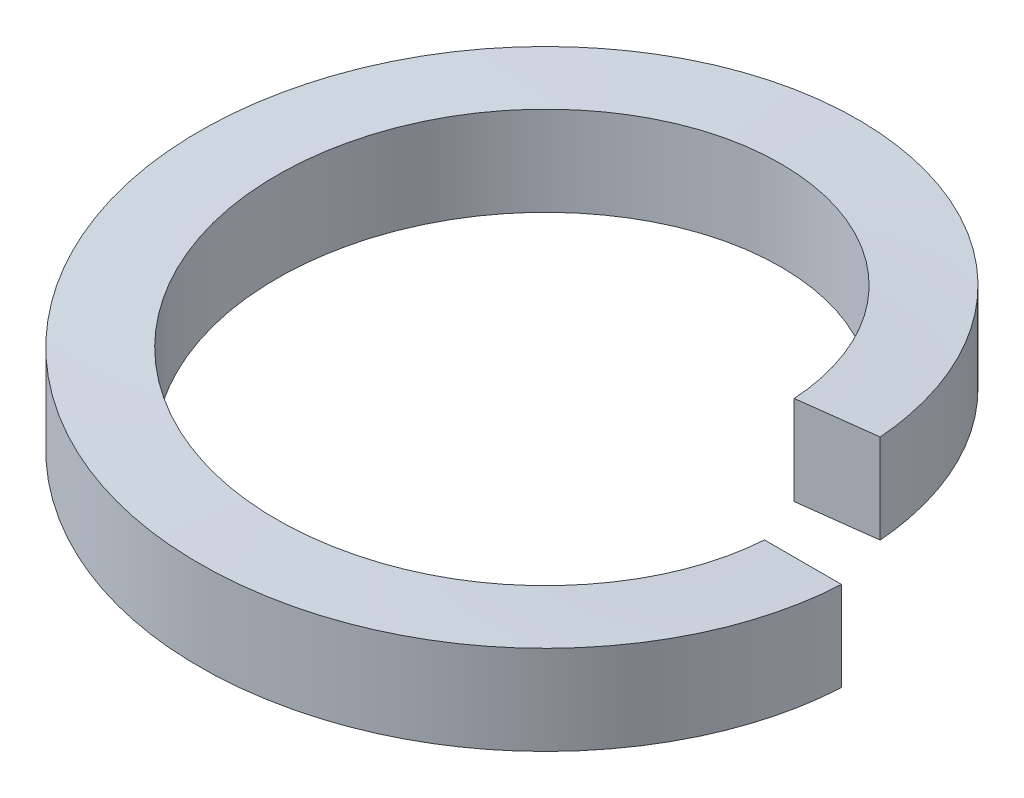
ISO-10303-21;
HEADER;
FILE_DESCRIPTION(('STEP AP214'),'2;1');
FILE_NAME('part.step','',(''),(''),'','','');
FILE_SCHEMA(('AUTOMOTIVE_DESIGN { 1 0 10303 214 1 1 1 1 }'));
ENDSEC;
DATA;
#1=APPLICATION_CONTEXT('core data for automotive mechanical design processes');
#2=APPLICATION_PROTOCOL_DEFINITION('international standard','automotive_design',2000,#1);
#3=PRODUCT_CONTEXT('',#1,'mechanical');
#4=PRODUCT('Part','Part','',(#3));
#5=PRODUCT_RELATED_PRODUCT_CATEGORY('part','',(#4));
#6=PRODUCT_DEFINITION_FORMATION('','',#4);
#7=PRODUCT_DEFINITION_CONTEXT('part definition',#1,'design');
#8=PRODUCT_DEFINITION('design','',#6,#7);
#9=PRODUCT_DEFINITION_SHAPE('','',#8);
#10=(LENGTH_UNIT() NAMED_UNIT(*) SI_UNIT(.MILLI.,.METRE.));
#11=(NAMED_UNIT(*) PLANE_ANGLE_UNIT() SI_UNIT($,.RADIAN.));
#12=(NAMED_UNIT(*) SI_UNIT($,.STERADIAN.) SOLID_ANGLE_UNIT());
#13=UNCERTAINTY_MEASURE_WITH_UNIT(LENGTH_MEASURE(1.E-05),#10,'distance_accuracy_value','');
#14=(GEOMETRIC_REPRESENTATION_CONTEXT(3) GLOBAL_UNCERTAINTY_ASSIGNED_CONTEXT((#13)) GLOBAL_UNIT_ASSIGNED_CONTEXT((#10,
#11,#12)) REPRESENTATION_CONTEXT('',''));
#15=CARTESIAN_POINT('',(0.,0.,0.));
#16=DIRECTION('',(0.,0.,1.));
#17=DIRECTION('',(1.,0.,0.));
#18=AXIS2_PLACEMENT_3D('',#15,#16,#17);
#19=CARTESIAN_POINT('',(3.28,0.58,0.));
#20=DIRECTION('',(0.,0.,1.));
#21=DIRECTION('',(1.,0.,0.));
#22=AXIS2_PLACEMENT_3D('',#19,#20,#21);
#23=PLANE('',#22);
#24=CARTESIAN_POINT('',(3.28,1.16,0.));
#25=CARTESIAN_POINT('',(3.28,0.,0.));
#26=(BOUNDED_CURVE() B_SPLINE_CURVE(1,(#24,#25),.UNSPECIFIED.,.F.,
.F.) B_SPLINE_CURVE_WITH_KNOTS((2,2),(0.,1.),
.UNSPECIFIED.) CURVE() GEOMETRIC_REPRESENTATION_ITEM() RATIONAL_B_SPLINE_CURVE((1.,1.)) REPRESENTATION_ITEM(''));
#27=CARTESIAN_POINT('',(3.28,1.16,0.));
#28=VERTEX_POINT('',#27);
#29=CARTESIAN_POINT('',(3.28,0.,0.));
#30=VERTEX_POINT('',#29);
#31=EDGE_CURVE('E53',#28,#30,#26,.T.);
#32=ORIENTED_EDGE('',*,*,#31,.F.);
#33=CARTESIAN_POINT('',(4.28,1.16,0.));
#34=CARTESIAN_POINT('',(3.28,1.16,0.));
#35=(BOUNDED_CURVE() B_SPLINE_CURVE(1,(#33,#34),.UNSPECIFIED.,.F.,
.F.) B_SPLINE_CURVE_WITH_KNOTS((2,2),(0.,1.),
.UNSPECIFIED.) CURVE() GEOMETRIC_REPRESENTATION_ITEM() RATIONAL_B_SPLINE_CURVE((1.,1.)) REPRESENTATION_ITEM(''));
#36=CARTESIAN_POINT('',(4.28,1.16,0.));
#37=VERTEX_POINT('',#36);
#38=EDGE_CURVE('E66',#37,#28,#35,.T.);
#39=ORIENTED_EDGE('',*,*,#38,.F.);
#40=CARTESIAN_POINT('',(4.28,0.,0.));
#41=CARTESIAN_POINT('',(4.28,1.16,0.));
#42=(BOUNDED_CURVE() B_SPLINE_CURVE(1,(#40,#41),.UNSPECIFIED.,.F.,
.F.) B_SPLINE_CURVE_WITH_KNOTS((2,2),(0.,1.),
.UNSPECIFIED.) CURVE() GEOMETRIC_REPRESENTATION_ITEM() RATIONAL_B_SPLINE_CURVE((1.,1.)) REPRESENTATION_ITEM(''));
#43=CARTESIAN_POINT('',(4.28,0.,0.));
#44=VERTEX_POINT('',#43);
#45=EDGE_CURVE('E104',#44,#37,#42,.T.);
#46=ORIENTED_EDGE('',*,*,#45,.F.);
#47=CARTESIAN_POINT('',(3.28,0.,0.));
#48=CARTESIAN_POINT('',(4.28,0.,0.));
#49=(BOUNDED_CURVE() B_SPLINE_CURVE(1,(#47,#48),.UNSPECIFIED.,.F.,
.F.) B_SPLINE_CURVE_WITH_KNOTS((2,2),(0.,1.),
.UNSPECIFIED.) CURVE() GEOMETRIC_REPRESENTATION_ITEM() RATIONAL_B_SPLINE_CURVE((1.,1.)) REPRESENTATION_ITEM(''));
#50=EDGE_CURVE('E87',#30,#44,#49,.T.);
#51=ORIENTED_EDGE('',*,*,#50,.F.);
#52=EDGE_LOOP('',(#32,#39,#46,#51));
#53=FACE_BOUND('',#52,.T.);
#54=ADVANCED_FACE('F42',(#53),#23,.F.);
#55=CARTESIAN_POINT('',(3.25412922151744,1.66283042754643,-0.411148403458249));
#56=DIRECTION('',(0.125350122672277,0.,0.992112567577916));
#57=DIRECTION('',(0.992112567577916,0.,-0.125350122672277));
#58=AXIS2_PLACEMENT_3D('',#55,#56,#57);
#59=PLANE('',#58);
#60=CARTESIAN_POINT('',(3.25412922151745,1.37283042754643,-0.411148403458249));
#61=CARTESIAN_POINT('',(3.25412922151745,2.53283042754643,-0.411148403458249));
#62=(BOUNDED_CURVE() B_SPLINE_CURVE(1,(#60,#61),.UNSPECIFIED.,.F.,
.F.) B_SPLINE_CURVE_WITH_KNOTS((2,2),(0.,1.),
.UNSPECIFIED.) CURVE() GEOMETRIC_REPRESENTATION_ITEM() RATIONAL_B_SPLINE_CURVE((0.979291882996512,0.979291882996512)) REPRESENTATION_ITEM(''));
#63=CARTESIAN_POINT('',(3.25412922151744,1.37283042754643,-0.411148403458249));
#64=VERTEX_POINT('',#63);
#65=CARTESIAN_POINT('',(3.25413066197617,2.53283120024897,-0.411137002293022));
#66=VERTEX_POINT('',#65);
#67=EDGE_CURVE('E12',#64,#66,#62,.T.);
#68=ORIENTED_EDGE('',*,*,#67,.F.);
#69=CARTESIAN_POINT('',(4.24624178908679,1.37283042756022,-0.536498526198341));
#70=CARTESIAN_POINT('',(3.25412922154315,1.37283042756022,-0.411148403254803));
#71=(BOUNDED_CURVE() B_SPLINE_CURVE(1,(#69,#70),.UNSPECIFIED.,.F.,
.F.) B_SPLINE_CURVE_WITH_KNOTS((2,2),(0.,1.),
.UNSPECIFIED.) CURVE() GEOMETRIC_REPRESENTATION_ITEM() RATIONAL_B_SPLINE_CURVE((0.979291883004735,0.979291883004735)) REPRESENTATION_ITEM(''));
#72=CARTESIAN_POINT('',(4.24624366865945,1.37283120024207,-0.53648364946633));
#73=VERTEX_POINT('',#72);
#74=EDGE_CURVE('E99',#73,#64,#71,.T.);
#75=ORIENTED_EDGE('',*,*,#74,.F.);
#76=CARTESIAN_POINT('',(4.2462455482321,2.53283197292392,-0.536468772734318));
#77=CARTESIAN_POINT('',(4.2462455482321,1.37283197292392,-0.536468772734318));
#78=(BOUNDED_CURVE() B_SPLINE_CURVE(1,(#76,#77),.UNSPECIFIED.,.F.,
.F.) B_SPLINE_CURVE_WITH_KNOTS((2,2),(0.,1.),
.UNSPECIFIED.) CURVE() GEOMETRIC_REPRESENTATION_ITEM() RATIONAL_B_SPLINE_CURVE((0.979292804627174,0.979292804627174)) REPRESENTATION_ITEM(''));
#79=CARTESIAN_POINT('',(4.2462455482321,2.53283197292392,-0.536468772734318));
#80=VERTEX_POINT('',#79);
#81=EDGE_CURVE('E106',#80,#73,#78,.T.);
#82=ORIENTED_EDGE('',*,*,#81,.F.);
#83=CARTESIAN_POINT('',(3.25413210243489,2.5328319729515,-0.411125601127795));
#84=CARTESIAN_POINT('',(4.24624554829918,2.5328319729515,-0.536468772203342));
#85=(BOUNDED_CURVE() B_SPLINE_CURVE(1,(#83,#84),.UNSPECIFIED.,.F.,
.F.) B_SPLINE_CURVE_WITH_KNOTS((2,2),(0.,1.),
.UNSPECIFIED.) CURVE() GEOMETRIC_REPRESENTATION_ITEM() RATIONAL_B_SPLINE_CURVE((0.979292804643621,0.979292804643621)) REPRESENTATION_ITEM(''));
#86=EDGE_CURVE('E143',#66,#80,#85,.T.);
#87=ORIENTED_EDGE('',*,*,#86,.F.);
#88=EDGE_LOOP('',(#68,#75,#82,#87));
#89=FACE_BOUND('',#88,.T.);
#90=ADVANCED_FACE('F44',(#89),#59,.T.);
#91=CARTESIAN_POINT('',(3.28,1.16,0.));
#92=CARTESIAN_POINT('',(3.28,1.2475,1.35862048458375));
#93=CARTESIAN_POINT('',(2.31931024229188,1.335,2.31931024229188));
#94=CARTESIAN_POINT('',(1.35862048458375,1.4225,3.28));
#95=CARTESIAN_POINT('',(0.,1.51,3.28));
#96=CARTESIAN_POINT('',(-1.35862048458375,1.5975,3.28));
#97=CARTESIAN_POINT('',(-2.31931024229188,1.685,2.31931024229188));
#98=CARTESIAN_POINT('',(-3.28,1.7725,1.35862048458375));
#99=CARTESIAN_POINT('',(-3.28,1.86,0.));
#100=CARTESIAN_POINT('',(-3.28,1.9475,-1.35862048458375));
#101=CARTESIAN_POINT('',(-2.31931024229188,2.035,-2.31931024229188));
#102=CARTESIAN_POINT('',(-1.35862048458375,2.1225,-3.28));
#103=CARTESIAN_POINT('',(0.,2.21,-3.28));
#104=CARTESIAN_POINT('',(1.35862048458375,2.2975,-3.28));
#105=CARTESIAN_POINT('',(2.31931024229188,2.385,-2.31931024229188));
#106=CARTESIAN_POINT('',(3.11336556943676,2.45732287069546,-1.52525491514699));
#107=CARTESIAN_POINT('',(3.25412922151745,2.53283042754643,-0.411148403458249));
#108=CARTESIAN_POINT('',(3.26672165184571,2.53958518017503,-0.311482698431926));
#109=CARTESIAN_POINT('',(3.27931408217397,2.54633993280363,-0.211816993405603));
#110=CARTESIAN_POINT('',(3.28,0.,0.));
#111=CARTESIAN_POINT('',(3.28,0.0875,1.35862048458375));
#112=CARTESIAN_POINT('',(2.31931024229188,0.175,2.31931024229188));
#113=CARTESIAN_POINT('',(1.35862048458375,0.2625,3.28));
#114=CARTESIAN_POINT('',(0.,0.35,3.28));
#115=CARTESIAN_POINT('',(-1.35862048458375,0.4375,3.28));
#116=CARTESIAN_POINT('',(-2.31931024229188,0.525,2.31931024229188));
#117=CARTESIAN_POINT('',(-3.28,0.6125,1.35862048458375));
#118=CARTESIAN_POINT('',(-3.28,0.7,0.));
#119=CARTESIAN_POINT('',(-3.28,0.7875,-1.35862048458375));
#120=CARTESIAN_POINT('',(-2.31931024229188,0.875,-2.31931024229188));
#121=CARTESIAN_POINT('',(-1.35862048458375,0.9625,-3.28));
#122=CARTESIAN_POINT('',(0.,1.05,-3.28));
#123=CARTESIAN_POINT('',(1.35862048458375,1.1375,-3.28));
#124=CARTESIAN_POINT('',(2.31931024229188,1.225,-2.31931024229188));
#125=CARTESIAN_POINT('',(3.11336556943676,1.29732287069546,-1.52525491514699));
#126=CARTESIAN_POINT('',(3.25412922151745,1.37283042754643,-0.411148403458249));
#127=CARTESIAN_POINT('',(3.26672165184571,1.37958518017503,-0.311482698431926));
#128=CARTESIAN_POINT('',(3.27931408217397,1.38633993280363,-0.211816993405603));
#129=(BOUNDED_SURFACE() B_SPLINE_SURFACE(1,2,((#91,#92,#93,#94,#95,#96,#97,#98,#99,#100,#101,
#102,#103,#104,#105,#106,#107,#108,#109),(#110,#111,#112,#113,#114,#115,#116,#117,#118,#119,
#120,#121,#122,#123,#124,#125,#126,#127,#128)),.UNSPECIFIED.,.F.,.F.,
.F.) B_SPLINE_SURFACE_WITH_KNOTS((2,2),(3,2,2,2,2,2,2,2,2,3),(0.,1.),(0.,0.125,0.25,0.375,0.5,
0.625,0.75,0.875,0.979700784281378,0.989497792124192),
.UNSPECIFIED.) GEOMETRIC_REPRESENTATION_ITEM() RATIONAL_B_SPLINE_SURFACE(((1.,0.923879532511287,
1.,0.923879532511287,1.,0.923879532511287,1.,0.923879532511287,1.,0.923879532511287,1.,
0.923879532511287,1.,0.923879532511287,1.,0.936241018832533,0.979291882996512,0.979291882996512,
0.979291882996512),(1.,0.923879532511287,1.,0.923879532511287,1.,0.923879532511287,1.,
0.923879532511287,1.,0.923879532511287,1.,0.923879532511287,1.,0.923879532511287,1.,
0.936241018832533,0.979291882996512,0.979291882996512,0.979291882996512))) REPRESENTATION_ITEM('') SURFACE());
#130=CARTESIAN_POINT('',(3.28,0.,0.));
#131=CARTESIAN_POINT('',(3.28,0.0875,1.35862048458375));
#132=CARTESIAN_POINT('',(2.31931024229188,0.175,2.31931024229188));
#133=CARTESIAN_POINT('',(1.35862048458375,0.2625,3.28));
#134=CARTESIAN_POINT('',(0.,0.35,3.28));
#135=CARTESIAN_POINT('',(-1.35862048458375,0.4375,3.28));
#136=CARTESIAN_POINT('',(-2.31931024229188,0.525,2.31931024229188));
#137=CARTESIAN_POINT('',(-3.28,0.6125,1.35862048458375));
#138=CARTESIAN_POINT('',(-3.28,0.7,0.));
#139=CARTESIAN_POINT('',(-3.28,0.7875,-1.35862048458375));
#140=CARTESIAN_POINT('',(-2.31931024229188,0.875,-2.31931024229188));
#141=CARTESIAN_POINT('',(-1.35862048458375,0.9625,-3.28));
#142=CARTESIAN_POINT('',(0.,1.05,-3.28));
#143=CARTESIAN_POINT('',(1.35862048458375,1.1375,-3.28));
#144=CARTESIAN_POINT('',(2.31931024229188,1.225,-2.31931024229188));
#145=CARTESIAN_POINT('',(3.11336556943676,1.29732287069546,-1.52525491514699));
#146=CARTESIAN_POINT('',(3.25412922151745,1.37283042754643,-0.411148403458249));
#147=(BOUNDED_CURVE() B_SPLINE_CURVE(2,(#130,#131,#132,#133,#134,#135,#136,#137,#138,#139,#140,
#141,#142,#143,#144,#145,#146),.UNSPECIFIED.,.F.,.F.) B_SPLINE_CURVE_WITH_KNOTS((3,2,2,2,2,2,2,
2,3),(0.,0.125,0.25,0.375,0.5,0.625,0.75,0.875,0.979700784281378),
.UNSPECIFIED.) CURVE() GEOMETRIC_REPRESENTATION_ITEM() RATIONAL_B_SPLINE_CURVE((1.,
0.923879532511287,1.,0.923879532511287,1.,0.923879532511287,1.,0.923879532511287,1.,
0.923879532511287,1.,0.923879532511287,1.,0.923879532511287,1.,0.936241018832533,0.979291882996512)) REPRESENTATION_ITEM(''));
#148=EDGE_CURVE('E94',#30,#64,#147,.T.);
#149=CARTESIAN_POINT('',(3.28,1.16,0.));
#150=CARTESIAN_POINT('',(3.28,1.2475,1.35862048458375));
#151=CARTESIAN_POINT('',(2.31931024229188,1.335,2.31931024229188));
#152=CARTESIAN_POINT('',(1.35862048458375,1.4225,3.28));
#153=CARTESIAN_POINT('',(0.,1.51,3.28));
#154=CARTESIAN_POINT('',(-1.35862048458375,1.5975,3.28));
#155=CARTESIAN_POINT('',(-2.31931024229188,1.685,2.31931024229188));
#156=CARTESIAN_POINT('',(-3.28,1.7725,1.35862048458375));
#157=CARTESIAN_POINT('',(-3.28,1.86,0.));
#158=CARTESIAN_POINT('',(-3.28,1.9475,-1.35862048458375));
#159=CARTESIAN_POINT('',(-2.31931024229188,2.035,-2.31931024229188));
#160=CARTESIAN_POINT('',(-1.35862048458375,2.1225,-3.28));
#161=CARTESIAN_POINT('',(0.,2.21,-3.28));
#162=CARTESIAN_POINT('',(1.35862048458375,2.2975,-3.28));
#163=CARTESIAN_POINT('',(2.31931024229188,2.385,-2.31931024229188));
#164=CARTESIAN_POINT('',(3.1133746478604,2.45732369756185,-1.52524583672335));
#165=CARTESIAN_POINT('',(3.25413210243489,2.5328319729515,-0.411125601127795));
#166=(BOUNDED_CURVE() B_SPLINE_CURVE(2,(#149,#150,#151,#152,#153,#154,#155,#156,#157,#158,#159,
#160,#161,#162,#163,#164,#165),.UNSPECIFIED.,.F.,.F.) B_SPLINE_CURVE_WITH_KNOTS((3,2,2,2,2,2,2,
2,3),(0.,0.125,0.25,0.375,0.5,0.625,0.75,0.875,0.97970190500097),
.UNSPECIFIED.) CURVE() GEOMETRIC_REPRESENTATION_ITEM() RATIONAL_B_SPLINE_CURVE((1.,
0.923879532511287,1.,0.923879532511287,1.,0.923879532511287,1.,0.923879532511287,1.,
0.923879532511287,1.,0.923879532511287,1.,0.923879532511287,1.,0.936240336354939,0.979292804643621)) REPRESENTATION_ITEM(''));
#167=EDGE_CURVE('E60',#28,#66,#166,.T.);
#168=ORIENTED_EDGE('',*,*,#31,.T.);
#169=ORIENTED_EDGE('',*,*,#148,.T.);
#170=ORIENTED_EDGE('',*,*,#67,.T.);
#171=ORIENTED_EDGE('',*,*,#167,.F.);
#172=EDGE_LOOP('',(#168,#169,#170,#171));
#173=FACE_BOUND('',#172,.T.);
#174=ADVANCED_FACE('F182',(#173),#129,.T.);
#175=CARTESIAN_POINT('',(4.28,1.16,0.));
#176=CARTESIAN_POINT('',(4.28,1.2475,1.77283404695685));
#177=CARTESIAN_POINT('',(3.02641702347842,1.335,3.02641702347842));
#178=CARTESIAN_POINT('',(1.77283404695685,1.4225,4.28));
#179=CARTESIAN_POINT('',(0.,1.51,4.28));
#180=CARTESIAN_POINT('',(-1.77283404695685,1.5975,4.28));
#181=CARTESIAN_POINT('',(-3.02641702347842,1.685,3.02641702347842));
#182=CARTESIAN_POINT('',(-4.28,1.7725,1.77283404695685));
#183=CARTESIAN_POINT('',(-4.28,1.86,0.));
#184=CARTESIAN_POINT('',(-4.28,1.9475,-1.77283404695685));
#185=CARTESIAN_POINT('',(-3.02641702347842,2.035,-3.02641702347842));
#186=CARTESIAN_POINT('',(-1.77283404695685,2.1225,-4.28));
#187=CARTESIAN_POINT('',(0.,2.21,-4.28));
#188=CARTESIAN_POINT('',(1.77283404695685,2.2975,-4.28));
#189=CARTESIAN_POINT('',(3.02641702347842,2.385,-3.02641702347842));
#190=CARTESIAN_POINT('',(4.06257423562272,2.45732369756185,-1.99025981133413));
#191=CARTESIAN_POINT('',(4.24624554829918,2.5328319729515,-0.536468772203342));
#192=CARTESIAN_POINT('',(3.28,1.16,0.));
#193=CARTESIAN_POINT('',(3.28,1.2475,1.35862048458375));
#194=CARTESIAN_POINT('',(2.31931024229188,1.335,2.31931024229188));
#195=CARTESIAN_POINT('',(1.35862048458375,1.4225,3.28));
#196=CARTESIAN_POINT('',(0.,1.51,3.28));
#197=CARTESIAN_POINT('',(-1.35862048458375,1.5975,3.28));
#198=CARTESIAN_POINT('',(-2.31931024229188,1.685,2.31931024229188));
#199=CARTESIAN_POINT('',(-3.28,1.7725,1.35862048458375));
#200=CARTESIAN_POINT('',(-3.28,1.86,0.));
#201=CARTESIAN_POINT('',(-3.28,1.9475,-1.35862048458375));
#202=CARTESIAN_POINT('',(-2.31931024229188,2.035,-2.31931024229188));
#203=CARTESIAN_POINT('',(-1.35862048458375,2.1225,-3.28));
#204=CARTESIAN_POINT('',(0.,2.21,-3.28));
#205=CARTESIAN_POINT('',(1.35862048458375,2.2975,-3.28));
#206=CARTESIAN_POINT('',(2.31931024229188,2.385,-2.31931024229188));
#207=CARTESIAN_POINT('',(3.1133746478604,2.45732369756185,-1.52524583672335));
#208=CARTESIAN_POINT('',(3.25413210243489,2.5328319729515,-0.411125601127795));
#209=(BOUNDED_SURFACE() B_SPLINE_SURFACE(1,2,((#175,#176,#177,#178,#179,#180,#181,#182,#183,
#184,#185,#186,#187,#188,#189,#190,#191),(#192,#193,#194,#195,#196,#197,#198,#199,#200,#201,
#202,#203,#204,#205,#206,#207,#208)),.UNSPECIFIED.,.F.,.F.,.F.) B_SPLINE_SURFACE_WITH_KNOTS((2,
2),(3,2,2,2,2,2,2,2,3),(0.,1.),(0.,0.125,0.25,0.375,0.5,0.625,0.75,0.875,0.97970190500097),
.UNSPECIFIED.) GEOMETRIC_REPRESENTATION_ITEM() RATIONAL_B_SPLINE_SURFACE(((1.,0.923879532511287,
1.,0.923879532511287,1.,0.923879532511287,1.,0.923879532511287,1.,0.923879532511287,1.,
0.923879532511287,1.,0.923879532511287,1.,0.936240336354939,0.979292804643621),(1.,
0.923879532511287,1.,0.923879532511287,1.,0.923879532511287,1.,0.923879532511287,1.,
0.923879532511287,1.,0.923879532511287,1.,0.923879532511287,1.,0.936240336354939,0.979292804643621))) REPRESENTATION_ITEM('') SURFACE());
#210=CARTESIAN_POINT('',(4.28,1.16,0.));
#211=CARTESIAN_POINT('',(4.28,1.2475,1.77283404695685));
#212=CARTESIAN_POINT('',(3.02641702347842,1.335,3.02641702347842));
#213=CARTESIAN_POINT('',(1.77283404695685,1.4225,4.28));
#214=CARTESIAN_POINT('',(0.,1.51,4.28));
#215=CARTESIAN_POINT('',(-1.77283404695685,1.5975,4.28));
#216=CARTESIAN_POINT('',(-3.02641702347842,1.685,3.02641702347842));
#217=CARTESIAN_POINT('',(-4.28,1.7725,1.77283404695685));
#218=CARTESIAN_POINT('',(-4.28,1.86,0.));
#219=CARTESIAN_POINT('',(-4.28,1.9475,-1.77283404695685));
#220=CARTESIAN_POINT('',(-3.02641702347842,2.035,-3.02641702347842));
#221=CARTESIAN_POINT('',(-1.77283404695685,2.1225,-4.28));
#222=CARTESIAN_POINT('',(0.,2.21,-4.28));
#223=CARTESIAN_POINT('',(1.77283404695685,2.2975,-4.28));
#224=CARTESIAN_POINT('',(3.02641702347842,2.385,-3.02641702347842));
#225=CARTESIAN_POINT('',(4.06257423541132,2.45732369754709,-1.99025981154553));
#226=CARTESIAN_POINT('',(4.2462455482321,2.53283197292392,-0.536468772734318));
#227=(BOUNDED_CURVE() B_SPLINE_CURVE(2,(#210,#211,#212,#213,#214,#215,#216,#217,#218,#219,#220,
#221,#222,#223,#224,#225,#226),.UNSPECIFIED.,.F.,.F.) B_SPLINE_CURVE_WITH_KNOTS((3,2,2,2,2,2,2,
2,3),(0.,0.125,0.25,0.375,0.5,0.625,0.75,0.875,0.97970190498097),
.UNSPECIFIED.) CURVE() GEOMETRIC_REPRESENTATION_ITEM() RATIONAL_B_SPLINE_CURVE((1.,
0.923879532511287,1.,0.923879532511287,1.,0.923879532511287,1.,0.923879532511287,1.,
0.923879532511287,1.,0.923879532511287,1.,0.923879532511287,1.,0.936240336367118,0.979292804627174)) REPRESENTATION_ITEM(''));
#228=EDGE_CURVE('E110',#37,#80,#227,.T.);
#229=ORIENTED_EDGE('',*,*,#38,.T.);
#230=ORIENTED_EDGE('',*,*,#167,.T.);
#231=ORIENTED_EDGE('',*,*,#86,.T.);
#232=ORIENTED_EDGE('',*,*,#228,.F.);
#233=EDGE_LOOP('',(#229,#230,#231,#232));
#234=FACE_BOUND('',#233,.T.);
#235=ADVANCED_FACE('F202',(#234),#209,.T.);
#236=CARTESIAN_POINT('',(4.28,0.,0.));
#237=CARTESIAN_POINT('',(4.28,0.0875000000000006,1.77283404695685));
#238=CARTESIAN_POINT('',(3.02641702347842,0.175000000000001,3.02641702347842));
#239=CARTESIAN_POINT('',(1.77283404695685,0.262500000000001,4.28));
#240=CARTESIAN_POINT('',(0.,0.350000000000001,4.28));
#241=CARTESIAN_POINT('',(-1.77283404695685,0.437500000000001,4.28));
#242=CARTESIAN_POINT('',(-3.02641702347842,0.525000000000001,3.02641702347842));
#243=CARTESIAN_POINT('',(-4.28,0.612500000000001,1.77283404695685));
#244=CARTESIAN_POINT('',(-4.28,0.700000000000001,0.));
#245=CARTESIAN_POINT('',(-4.28,0.787500000000001,-1.77283404695685));
#246=CARTESIAN_POINT('',(-3.02641702347842,0.875000000000001,-3.02641702347842));
#247=CARTESIAN_POINT('',(-1.77283404695685,0.962500000000001,-4.28));
#248=CARTESIAN_POINT('',(0.,1.05,-4.28));
#249=CARTESIAN_POINT('',(1.77283404695685,1.1375,-4.28));
#250=CARTESIAN_POINT('',(3.02641702347842,1.225,-3.02641702347842));
#251=CARTESIAN_POINT('',(4.06257423541132,1.29732369754709,-1.99025981154553));
#252=CARTESIAN_POINT('',(4.2462455482321,1.37283197292392,-0.536468772734318));
#253=CARTESIAN_POINT('',(4.28,1.16,0.));
#254=CARTESIAN_POINT('',(4.28,1.2475,1.77283404695685));
#255=CARTESIAN_POINT('',(3.02641702347842,1.335,3.02641702347842));
#256=CARTESIAN_POINT('',(1.77283404695685,1.4225,4.28));
#257=CARTESIAN_POINT('',(0.,1.51,4.28));
#258=CARTESIAN_POINT('',(-1.77283404695685,1.5975,4.28));
#259=CARTESIAN_POINT('',(-3.02641702347842,1.685,3.02641702347842));
#260=CARTESIAN_POINT('',(-4.28,1.7725,1.77283404695685));
#261=CARTESIAN_POINT('',(-4.28,1.86,0.));
#262=CARTESIAN_POINT('',(-4.28,1.9475,-1.77283404695685));
#263=CARTESIAN_POINT('',(-3.02641702347842,2.035,-3.02641702347842));
#264=CARTESIAN_POINT('',(-1.77283404695685,2.1225,-4.28));
#265=CARTESIAN_POINT('',(0.,2.21,-4.28));
#266=CARTESIAN_POINT('',(1.77283404695685,2.2975,-4.28));
#267=CARTESIAN_POINT('',(3.02641702347842,2.385,-3.02641702347842));
#268=CARTESIAN_POINT('',(4.06257423541132,2.45732369754709,-1.99025981154553));
#269=CARTESIAN_POINT('',(4.2462455482321,2.53283197292392,-0.536468772734318));
#270=(BOUNDED_SURFACE() B_SPLINE_SURFACE(1,2,((#236,#237,#238,#239,#240,#241,#242,#243,#244,
#245,#246,#247,#248,#249,#250,#251,#252),(#253,#254,#255,#256,#257,#258,#259,#260,#261,#262,
#263,#264,#265,#266,#267,#268,#269)),.UNSPECIFIED.,.F.,.F.,.F.) B_SPLINE_SURFACE_WITH_KNOTS((2,
2),(3,2,2,2,2,2,2,2,3),(0.,1.),(0.,0.125,0.25,0.375,0.5,0.625,0.75,0.875,0.97970190498097),
.UNSPECIFIED.) GEOMETRIC_REPRESENTATION_ITEM() RATIONAL_B_SPLINE_SURFACE(((1.,0.923879532511287,
1.,0.923879532511287,1.,0.923879532511287,1.,0.923879532511287,1.,0.923879532511287,1.,
0.923879532511287,1.,0.923879532511287,1.,0.936240336367118,0.979292804627174),(1.,
0.923879532511287,1.,0.923879532511287,1.,0.923879532511287,1.,0.923879532511287,1.,
0.923879532511287,1.,0.923879532511287,1.,0.923879532511287,1.,0.936240336367118,0.979292804627174))) REPRESENTATION_ITEM('') SURFACE());
#271=CARTESIAN_POINT('',(4.28,0.,0.));
#272=CARTESIAN_POINT('',(4.28,0.0875000000000006,1.77283404695685));
#273=CARTESIAN_POINT('',(3.02641702347842,0.175000000000001,3.02641702347842));
#274=CARTESIAN_POINT('',(1.77283404695685,0.262500000000001,4.28));
#275=CARTESIAN_POINT('',(0.,0.350000000000001,4.28));
#276=CARTESIAN_POINT('',(-1.77283404695685,0.437500000000001,4.28));
#277=CARTESIAN_POINT('',(-3.02641702347842,0.525000000000001,3.02641702347842));
#278=CARTESIAN_POINT('',(-4.28,0.612500000000001,1.77283404695685));
#279=CARTESIAN_POINT('',(-4.28,0.700000000000001,0.));
#280=CARTESIAN_POINT('',(-4.28,0.787500000000001,-1.77283404695685));
#281=CARTESIAN_POINT('',(-3.02641702347842,0.875000000000001,-3.02641702347842));
#282=CARTESIAN_POINT('',(-1.77283404695685,0.962500000000001,-4.28));
#283=CARTESIAN_POINT('',(0.,1.05,-4.28));
#284=CARTESIAN_POINT('',(1.77283404695685,1.1375,-4.28));
#285=CARTESIAN_POINT('',(3.02641702347842,1.225,-3.02641702347842));
#286=CARTESIAN_POINT('',(4.06256238949269,1.29732287070284,-1.99027165746416));
#287=CARTESIAN_POINT('',(4.24624178908679,1.37283042756022,-0.536498526198341));
#288=(BOUNDED_CURVE() B_SPLINE_CURVE(2,(#271,#272,#273,#274,#275,#276,#277,#278,#279,#280,#281,
#282,#283,#284,#285,#286,#287),.UNSPECIFIED.,.F.,.F.) B_SPLINE_CURVE_WITH_KNOTS((3,2,2,2,2,2,2,
2,3),(0.,0.125,0.25,0.375,0.5,0.625,0.75,0.875,0.979700784291377),
.UNSPECIFIED.) CURVE() GEOMETRIC_REPRESENTATION_ITEM() RATIONAL_B_SPLINE_CURVE((1.,
0.923879532511287,1.,0.923879532511287,1.,0.923879532511287,1.,0.923879532511287,1.,
0.923879532511287,1.,0.923879532511287,1.,0.923879532511287,1.,0.936241018826444,0.979291883004735)) REPRESENTATION_ITEM(''));
#289=EDGE_CURVE('E90',#44,#73,#288,.T.);
#290=ORIENTED_EDGE('',*,*,#45,.T.);
#291=ORIENTED_EDGE('',*,*,#228,.T.);
#292=ORIENTED_EDGE('',*,*,#81,.T.);
#293=ORIENTED_EDGE('',*,*,#289,.F.);
#294=EDGE_LOOP('',(#290,#291,#292,#293));
#295=FACE_BOUND('',#294,.T.);
#296=ADVANCED_FACE('F103',(#295),#270,.T.);
#297=CARTESIAN_POINT('',(3.28,0.,0.));
#298=CARTESIAN_POINT('',(3.28,0.0875,1.35862048458375));
#299=CARTESIAN_POINT('',(2.31931024229188,0.175,2.31931024229188));
#300=CARTESIAN_POINT('',(1.35862048458375,0.2625,3.28));
#301=CARTESIAN_POINT('',(0.,0.35,3.28));
#302=CARTESIAN_POINT('',(-1.35862048458375,0.4375,3.28));
#303=CARTESIAN_POINT('',(-2.31931024229188,0.525,2.31931024229188));
#304=CARTESIAN_POINT('',(-3.28,0.6125,1.35862048458375));
#305=CARTESIAN_POINT('',(-3.28,0.7,0.));
#306=CARTESIAN_POINT('',(-3.28,0.7875,-1.35862048458375));
#307=CARTESIAN_POINT('',(-2.31931024229188,0.875,-2.31931024229188));
#308=CARTESIAN_POINT('',(-1.35862048458375,0.9625,-3.28));
#309=CARTESIAN_POINT('',(0.,1.05,-3.28));
#310=CARTESIAN_POINT('',(1.35862048458375,1.1375,-3.28));
#311=CARTESIAN_POINT('',(2.31931024229188,1.225,-2.31931024229188));
#312=CARTESIAN_POINT('',(3.11336556951776,1.29732287070284,-1.52525491506599));
#313=CARTESIAN_POINT('',(3.25412922154315,1.37283042756022,-0.411148403254803));
#314=CARTESIAN_POINT('',(4.28,0.,0.));
#315=CARTESIAN_POINT('',(4.28,0.0875000000000006,1.77283404695685));
#316=CARTESIAN_POINT('',(3.02641702347842,0.175000000000001,3.02641702347842));
#317=CARTESIAN_POINT('',(1.77283404695685,0.262500000000001,4.28));
#318=CARTESIAN_POINT('',(0.,0.350000000000001,4.28));
#319=CARTESIAN_POINT('',(-1.77283404695685,0.437500000000001,4.28));
#320=CARTESIAN_POINT('',(-3.02641702347842,0.525000000000001,3.02641702347842));
#321=CARTESIAN_POINT('',(-4.28,0.612500000000001,1.77283404695685));
#322=CARTESIAN_POINT('',(-4.28,0.700000000000001,0.));
#323=CARTESIAN_POINT('',(-4.28,0.787500000000001,-1.77283404695685));
#324=CARTESIAN_POINT('',(-3.02641702347842,0.875000000000001,-3.02641702347842));
#325=CARTESIAN_POINT('',(-1.77283404695685,0.962500000000001,-4.28));
#326=CARTESIAN_POINT('',(0.,1.05,-4.28));
#327=CARTESIAN_POINT('',(1.77283404695685,1.1375,-4.28));
#328=CARTESIAN_POINT('',(3.02641702347842,1.225,-3.02641702347842));
#329=CARTESIAN_POINT('',(4.06256238949269,1.29732287070284,-1.99027165746416));
#330=CARTESIAN_POINT('',(4.24624178908679,1.37283042756022,-0.536498526198341));
#331=(BOUNDED_SURFACE() B_SPLINE_SURFACE(1,2,((#297,#298,#299,#300,#301,#302,#303,#304,#305,
#306,#307,#308,#309,#310,#311,#312,#313),(#314,#315,#316,#317,#318,#319,#320,#321,#322,#323,
#324,#325,#326,#327,#328,#329,#330)),.UNSPECIFIED.,.F.,.F.,.F.) B_SPLINE_SURFACE_WITH_KNOTS((2,
2),(3,2,2,2,2,2,2,2,3),(0.,1.),(0.,0.125,0.25,0.375,0.5,0.625,0.75,0.875,0.979700784291377),
.UNSPECIFIED.) GEOMETRIC_REPRESENTATION_ITEM() RATIONAL_B_SPLINE_SURFACE(((1.,0.923879532511287,
1.,0.923879532511287,1.,0.923879532511287,1.,0.923879532511287,1.,0.923879532511287,1.,
0.923879532511287,1.,0.923879532511287,1.,0.936241018826444,0.979291883004735),(1.,
0.923879532511287,1.,0.923879532511287,1.,0.923879532511287,1.,0.923879532511287,1.,
0.923879532511287,1.,0.923879532511287,1.,0.923879532511287,1.,0.936241018826444,0.979291883004735))) REPRESENTATION_ITEM('') SURFACE());
#332=ORIENTED_EDGE('',*,*,#50,.T.);
#333=ORIENTED_EDGE('',*,*,#289,.T.);
#334=ORIENTED_EDGE('',*,*,#74,.T.);
#335=ORIENTED_EDGE('',*,*,#148,.F.);
#336=EDGE_LOOP('',(#332,#333,#334,#335));
#337=FACE_BOUND('',#336,.T.);
#338=ADVANCED_FACE('F89',(#337),#331,.T.);
#339=CLOSED_SHELL('',(#54,#90,#174,#235,#296,#338));
#340=MANIFOLD_SOLID_BREP('B2',#339);
#341=ADVANCED_BREP_SHAPE_REPRESENTATION('',(#18,#340),#14);
#342=SHAPE_DEFINITION_REPRESENTATION(#9,#341);
ENDSEC;
END-ISO-10303-21;
